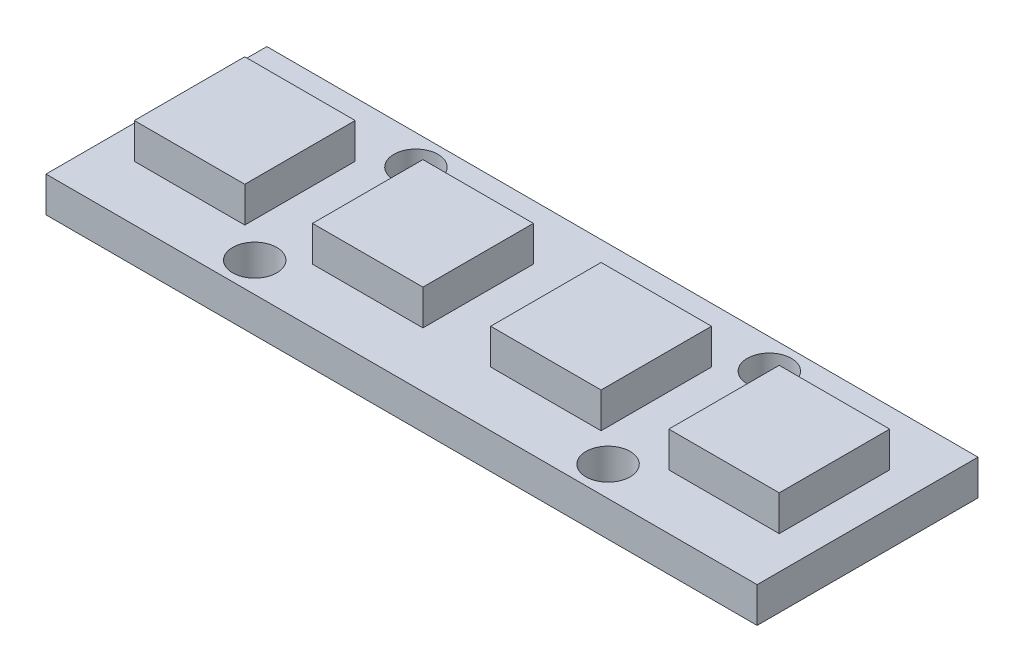
ISO-10303-21;
HEADER;
FILE_DESCRIPTION(('STEP AP214'),'2;1');
FILE_NAME('part.step','',(''),(''),'','','');
FILE_SCHEMA(('AUTOMOTIVE_DESIGN { 1 0 10303 214 1 1 1 1 }'));
ENDSEC;
DATA;
#1=APPLICATION_CONTEXT('core data for automotive mechanical design processes');
#2=APPLICATION_PROTOCOL_DEFINITION('international standard','automotive_design',2000,#1);
#3=PRODUCT_CONTEXT('',#1,'mechanical');
#4=PRODUCT('Part','Part','',(#3));
#5=PRODUCT_RELATED_PRODUCT_CATEGORY('part','',(#4));
#6=PRODUCT_DEFINITION_FORMATION('','',#4);
#7=PRODUCT_DEFINITION_CONTEXT('part definition',#1,'design');
#8=PRODUCT_DEFINITION('design','',#6,#7);
#9=PRODUCT_DEFINITION_SHAPE('','',#8);
#10=(LENGTH_UNIT() NAMED_UNIT(*) SI_UNIT(.MILLI.,.METRE.));
#11=(NAMED_UNIT(*) PLANE_ANGLE_UNIT() SI_UNIT($,.RADIAN.));
#12=(NAMED_UNIT(*) SI_UNIT($,.STERADIAN.) SOLID_ANGLE_UNIT());
#13=UNCERTAINTY_MEASURE_WITH_UNIT(LENGTH_MEASURE(1.E-05),#10,'distance_accuracy_value','');
#14=(GEOMETRIC_REPRESENTATION_CONTEXT(3) GLOBAL_UNCERTAINTY_ASSIGNED_CONTEXT((#13)) GLOBAL_UNIT_ASSIGNED_CONTEXT((#10,
#11,#12)) REPRESENTATION_CONTEXT('',''));
#15=CARTESIAN_POINT('',(0.,0.,0.));
#16=DIRECTION('',(0.,0.,1.));
#17=DIRECTION('',(1.,0.,0.));
#18=AXIS2_PLACEMENT_3D('',#15,#16,#17);
#19=CARTESIAN_POINT('',(0.,1.6,0.));
#20=DIRECTION('',(0.,1.,0.));
#21=DIRECTION('',(0.,0.,1.));
#22=AXIS2_PLACEMENT_3D('',#19,#20,#21);
#23=PLANE('',#22);
#24=CARTESIAN_POINT('',(8.,1.6,3.65));
#25=DIRECTION('',(0.,1.,0.));
#26=DIRECTION('',(0.,0.,-1.));
#27=AXIS2_PLACEMENT_3D('',#24,#25,#26);
#28=CIRCLE('',#27,1.);
#29=CARTESIAN_POINT('',(8.,1.6,2.65));
#30=VERTEX_POINT('',#29);
#31=EDGE_CURVE('E293',#30,#30,#28,.T.);
#32=ORIENTED_EDGE('',*,*,#31,.F.);
#33=EDGE_LOOP('',(#32));
#34=FACE_BOUND('',#33,.T.);
#35=CARTESIAN_POINT('',(-8.,1.6,-3.65));
#36=DIRECTION('',(0.,1.,0.));
#37=DIRECTION('',(0.,0.,1.));
#38=AXIS2_PLACEMENT_3D('',#35,#36,#37);
#39=CIRCLE('',#38,1.);
#40=CARTESIAN_POINT('',(-8.,1.6,-2.65));
#41=VERTEX_POINT('',#40);
#42=EDGE_CURVE('E305',#41,#41,#39,.T.);
#43=ORIENTED_EDGE('',*,*,#42,.F.);
#44=EDGE_LOOP('',(#43));
#45=FACE_BOUND('',#44,.T.);
#46=DIRECTION('',(0.,0.,-1.));
#47=VECTOR('',#46,1.);
#48=CARTESIAN_POINT('',(16.1,1.6,-5.));
#49=LINE('',#48,#47);
#50=CARTESIAN_POINT('',(16.1,1.6,5.));
#51=VERTEX_POINT('',#50);
#52=CARTESIAN_POINT('',(16.1,1.6,-5.));
#53=VERTEX_POINT('',#52);
#54=EDGE_CURVE('E311',#51,#53,#49,.T.);
#55=ORIENTED_EDGE('',*,*,#54,.T.);
#56=DIRECTION('',(-1.,0.,0.));
#57=VECTOR('',#56,1.);
#58=CARTESIAN_POINT('',(-16.1,1.6,-5.));
#59=LINE('',#58,#57);
#60=CARTESIAN_POINT('',(-16.1,1.6,-5.));
#61=VERTEX_POINT('',#60);
#62=EDGE_CURVE('E314',#53,#61,#59,.T.);
#63=ORIENTED_EDGE('',*,*,#62,.T.);
#64=DIRECTION('',(0.,0.,1.));
#65=VECTOR('',#64,1.);
#66=CARTESIAN_POINT('',(-16.1,1.6,-5.));
#67=LINE('',#66,#65);
#68=CARTESIAN_POINT('',(-16.1,1.6,5.));
#69=VERTEX_POINT('',#68);
#70=EDGE_CURVE('E317',#61,#69,#67,.T.);
#71=ORIENTED_EDGE('',*,*,#70,.T.);
#72=DIRECTION('',(1.,0.,0.));
#73=VECTOR('',#72,1.);
#74=CARTESIAN_POINT('',(-16.1,1.6,5.));
#75=LINE('',#74,#73);
#76=EDGE_CURVE('E319',#69,#51,#75,.T.);
#77=ORIENTED_EDGE('',*,*,#76,.T.);
#78=EDGE_LOOP('',(#55,#63,#71,#77));
#79=FACE_BOUND('',#78,.T.);
#80=CARTESIAN_POINT('',(8.,1.6,-3.65));
#81=DIRECTION('',(0.,1.,0.));
#82=DIRECTION('',(0.,0.,1.));
#83=AXIS2_PLACEMENT_3D('',#80,#81,#82);
#84=CIRCLE('',#83,1.);
#85=CARTESIAN_POINT('',(8.,1.6,-2.65));
#86=VERTEX_POINT('',#85);
#87=EDGE_CURVE('E299',#86,#86,#84,.T.);
#88=ORIENTED_EDGE('',*,*,#87,.F.);
#89=EDGE_LOOP('',(#88));
#90=FACE_BOUND('',#89,.T.);
#91=CARTESIAN_POINT('',(-8.,1.6,3.65));
#92=DIRECTION('',(0.,1.,0.));
#93=DIRECTION('',(0.,0.,-1.));
#94=AXIS2_PLACEMENT_3D('',#91,#92,#93);
#95=CIRCLE('',#94,1.);
#96=CARTESIAN_POINT('',(-8.,1.6,2.65));
#97=VERTEX_POINT('',#96);
#98=EDGE_CURVE('E287',#97,#97,#95,.T.);
#99=ORIENTED_EDGE('',*,*,#98,.F.);
#100=EDGE_LOOP('',(#99));
#101=FACE_BOUND('',#100,.T.);
#102=DIRECTION('',(-1.,0.,0.));
#103=VECTOR('',#102,1.);
#104=CARTESIAN_POINT('',(-14.6,1.6,-2.5));
#105=LINE('',#104,#103);
#106=CARTESIAN_POINT('',(-9.6,1.6,-2.5));
#107=VERTEX_POINT('',#106);
#108=CARTESIAN_POINT('',(-14.6,1.6,-2.5));
#109=VERTEX_POINT('',#108);
#110=EDGE_CURVE('E271',#107,#109,#105,.T.);
#111=ORIENTED_EDGE('',*,*,#110,.F.);
#112=DIRECTION('',(0.,0.,-1.));
#113=VECTOR('',#112,1.);
#114=CARTESIAN_POINT('',(-9.6,1.6,-2.5));
#115=LINE('',#114,#113);
#116=CARTESIAN_POINT('',(-9.6,1.6,2.5));
#117=VERTEX_POINT('',#116);
#118=EDGE_CURVE('E257',#117,#107,#115,.T.);
#119=ORIENTED_EDGE('',*,*,#118,.F.);
#120=DIRECTION('',(1.,0.,0.));
#121=VECTOR('',#120,1.);
#122=CARTESIAN_POINT('',(-14.6,1.6,2.5));
#123=LINE('',#122,#121);
#124=CARTESIAN_POINT('',(-14.6,1.6,2.5));
#125=VERTEX_POINT('',#124);
#126=EDGE_CURVE('E262',#125,#117,#123,.T.);
#127=ORIENTED_EDGE('',*,*,#126,.F.);
#128=DIRECTION('',(0.,0.,1.));
#129=VECTOR('',#128,1.);
#130=CARTESIAN_POINT('',(-14.6,1.6,-2.5));
#131=LINE('',#130,#129);
#132=EDGE_CURVE('E273',#109,#125,#131,.T.);
#133=ORIENTED_EDGE('',*,*,#132,.F.);
#134=EDGE_LOOP('',(#111,#119,#127,#133));
#135=FACE_BOUND('',#134,.T.);
#136=DIRECTION('',(-1.,0.,0.));
#137=VECTOR('',#136,1.);
#138=CARTESIAN_POINT('',(-6.53333333333334,1.6,-2.5));
#139=LINE('',#138,#137);
#140=CARTESIAN_POINT('',(-1.53333333333334,1.6,-2.5));
#141=VERTEX_POINT('',#140);
#142=CARTESIAN_POINT('',(-6.53333333333334,1.6,-2.5));
#143=VERTEX_POINT('',#142);
#144=EDGE_CURVE('E242',#141,#143,#139,.T.);
#145=ORIENTED_EDGE('',*,*,#144,.F.);
#146=DIRECTION('',(0.,0.,-1.));
#147=VECTOR('',#146,1.);
#148=CARTESIAN_POINT('',(-1.53333333333334,1.6,-2.5));
#149=LINE('',#148,#147);
#150=CARTESIAN_POINT('',(-1.53333333333334,1.6,2.5));
#151=VERTEX_POINT('',#150);
#152=EDGE_CURVE('E228',#151,#141,#149,.T.);
#153=ORIENTED_EDGE('',*,*,#152,.F.);
#154=DIRECTION('',(1.,0.,0.));
#155=VECTOR('',#154,1.);
#156=CARTESIAN_POINT('',(-6.53333333333334,1.6,2.5));
#157=LINE('',#156,#155);
#158=CARTESIAN_POINT('',(-6.53333333333334,1.6,2.5));
#159=VERTEX_POINT('',#158);
#160=EDGE_CURVE('E233',#159,#151,#157,.T.);
#161=ORIENTED_EDGE('',*,*,#160,.F.);
#162=DIRECTION('',(0.,0.,1.));
#163=VECTOR('',#162,1.);
#164=CARTESIAN_POINT('',(-6.53333333333334,1.6,-2.5));
#165=LINE('',#164,#163);
#166=EDGE_CURVE('E244',#143,#159,#165,.T.);
#167=ORIENTED_EDGE('',*,*,#166,.F.);
#168=EDGE_LOOP('',(#145,#153,#161,#167));
#169=FACE_BOUND('',#168,.T.);
#170=DIRECTION('',(-1.,0.,0.));
#171=VECTOR('',#170,1.);
#172=CARTESIAN_POINT('',(1.53333333333333,1.6,-2.5));
#173=LINE('',#172,#171);
#174=CARTESIAN_POINT('',(6.53333333333333,1.6,-2.5));
#175=VERTEX_POINT('',#174);
#176=CARTESIAN_POINT('',(1.53333333333333,1.6,-2.5));
#177=VERTEX_POINT('',#176);
#178=EDGE_CURVE('E200',#175,#177,#173,.T.);
#179=ORIENTED_EDGE('',*,*,#178,.F.);
#180=DIRECTION('',(0.,0.,-1.));
#181=VECTOR('',#180,1.);
#182=CARTESIAN_POINT('',(6.53333333333333,1.6,-2.5));
#183=LINE('',#182,#181);
#184=CARTESIAN_POINT('',(6.53333333333333,1.6,2.5));
#185=VERTEX_POINT('',#184);
#186=EDGE_CURVE('E197',#185,#175,#183,.T.);
#187=ORIENTED_EDGE('',*,*,#186,.F.);
#188=DIRECTION('',(1.,0.,0.));
#189=VECTOR('',#188,1.);
#190=CARTESIAN_POINT('',(1.53333333333333,1.6,2.5));
#191=LINE('',#190,#189);
#192=CARTESIAN_POINT('',(1.53333333333333,1.6,2.5));
#193=VERTEX_POINT('',#192);
#194=EDGE_CURVE('E209',#193,#185,#191,.T.);
#195=ORIENTED_EDGE('',*,*,#194,.F.);
#196=DIRECTION('',(0.,0.,1.));
#197=VECTOR('',#196,1.);
#198=CARTESIAN_POINT('',(1.53333333333333,1.6,-2.5));
#199=LINE('',#198,#197);
#200=EDGE_CURVE('E217',#177,#193,#199,.T.);
#201=ORIENTED_EDGE('',*,*,#200,.F.);
#202=EDGE_LOOP('',(#179,#187,#195,#201));
#203=FACE_BOUND('',#202,.T.);
#204=DIRECTION('',(-1.,0.,0.));
#205=VECTOR('',#204,1.);
#206=CARTESIAN_POINT('',(9.59999999999999,1.6,-2.5));
#207=LINE('',#206,#205);
#208=CARTESIAN_POINT('',(14.6,1.6,-2.5));
#209=VERTEX_POINT('',#208);
#210=CARTESIAN_POINT('',(9.59999999999999,1.6,-2.5));
#211=VERTEX_POINT('',#210);
#212=EDGE_CURVE('E658',#209,#211,#207,.T.);
#213=ORIENTED_EDGE('',*,*,#212,.F.);
#214=DIRECTION('',(0.,0.,-1.));
#215=VECTOR('',#214,1.);
#216=CARTESIAN_POINT('',(14.6,1.6,-2.5));
#217=LINE('',#216,#215);
#218=CARTESIAN_POINT('',(14.6,1.6,2.5));
#219=VERTEX_POINT('',#218);
#220=EDGE_CURVE('E195',#219,#209,#217,.T.);
#221=ORIENTED_EDGE('',*,*,#220,.F.);
#222=DIRECTION('',(1.,0.,0.));
#223=VECTOR('',#222,1.);
#224=CARTESIAN_POINT('',(9.59999999999999,1.6,2.5));
#225=LINE('',#224,#223);
#226=CARTESIAN_POINT('',(9.59999999999999,1.6,2.5));
#227=VERTEX_POINT('',#226);
#228=EDGE_CURVE('E191',#227,#219,#225,.T.);
#229=ORIENTED_EDGE('',*,*,#228,.F.);
#230=DIRECTION('',(0.,0.,1.));
#231=VECTOR('',#230,1.);
#232=CARTESIAN_POINT('',(9.59999999999999,1.6,-2.5));
#233=LINE('',#232,#231);
#234=EDGE_CURVE('E655',#211,#227,#233,.T.);
#235=ORIENTED_EDGE('',*,*,#234,.F.);
#236=EDGE_LOOP('',(#213,#221,#229,#235));
#237=FACE_BOUND('',#236,.T.);
#238=ADVANCED_FACE('F34',(#34,#45,#79,#90,#101,#135,#169,#203,#237),#23,.T.);
#239=CARTESIAN_POINT('',(0.,0.,0.));
#240=DIRECTION('',(0.,1.,0.));
#241=DIRECTION('',(0.,0.,1.));
#242=AXIS2_PLACEMENT_3D('',#239,#240,#241);
#243=PLANE('',#242);
#244=DIRECTION('',(0.,0.,-1.));
#245=VECTOR('',#244,1.);
#246=CARTESIAN_POINT('',(16.1,0.,-5.));
#247=LINE('',#246,#245);
#248=CARTESIAN_POINT('',(16.1,0.,5.));
#249=VERTEX_POINT('',#248);
#250=CARTESIAN_POINT('',(16.1,0.,-5.));
#251=VERTEX_POINT('',#250);
#252=EDGE_CURVE('E308',#249,#251,#247,.T.);
#253=ORIENTED_EDGE('',*,*,#252,.F.);
#254=DIRECTION('',(1.,0.,0.));
#255=VECTOR('',#254,1.);
#256=CARTESIAN_POINT('',(-16.1,0.,5.));
#257=LINE('',#256,#255);
#258=CARTESIAN_POINT('',(-16.1,0.,5.));
#259=VERTEX_POINT('',#258);
#260=EDGE_CURVE('E315',#259,#249,#257,.T.);
#261=ORIENTED_EDGE('',*,*,#260,.F.);
#262=DIRECTION('',(0.,0.,1.));
#263=VECTOR('',#262,1.);
#264=CARTESIAN_POINT('',(-16.1,0.,-5.));
#265=LINE('',#264,#263);
#266=CARTESIAN_POINT('',(-16.1,0.,-5.));
#267=VERTEX_POINT('',#266);
#268=EDGE_CURVE('E326',#267,#259,#265,.T.);
#269=ORIENTED_EDGE('',*,*,#268,.F.);
#270=DIRECTION('',(-1.,0.,0.));
#271=VECTOR('',#270,1.);
#272=CARTESIAN_POINT('',(-16.1,0.,-5.));
#273=LINE('',#272,#271);
#274=EDGE_CURVE('E324',#251,#267,#273,.T.);
#275=ORIENTED_EDGE('',*,*,#274,.F.);
#276=EDGE_LOOP('',(#253,#261,#269,#275));
#277=FACE_BOUND('',#276,.T.);
#278=CARTESIAN_POINT('',(-8.,0.,-3.65));
#279=DIRECTION('',(0.,1.,0.));
#280=DIRECTION('',(0.,0.,1.));
#281=AXIS2_PLACEMENT_3D('',#278,#279,#280);
#282=CIRCLE('',#281,1.);
#283=CARTESIAN_POINT('',(-8.,0.,-2.65));
#284=VERTEX_POINT('',#283);
#285=EDGE_CURVE('E302',#284,#284,#282,.T.);
#286=ORIENTED_EDGE('',*,*,#285,.T.);
#287=EDGE_LOOP('',(#286));
#288=FACE_BOUND('',#287,.T.);
#289=CARTESIAN_POINT('',(8.,0.,-3.65));
#290=DIRECTION('',(0.,1.,0.));
#291=DIRECTION('',(0.,0.,1.));
#292=AXIS2_PLACEMENT_3D('',#289,#290,#291);
#293=CIRCLE('',#292,1.);
#294=CARTESIAN_POINT('',(8.,0.,-2.65));
#295=VERTEX_POINT('',#294);
#296=EDGE_CURVE('E296',#295,#295,#293,.T.);
#297=ORIENTED_EDGE('',*,*,#296,.T.);
#298=EDGE_LOOP('',(#297));
#299=FACE_BOUND('',#298,.T.);
#300=CARTESIAN_POINT('',(8.,0.,3.65));
#301=DIRECTION('',(0.,1.,0.));
#302=DIRECTION('',(0.,0.,-1.));
#303=AXIS2_PLACEMENT_3D('',#300,#301,#302);
#304=CIRCLE('',#303,1.);
#305=CARTESIAN_POINT('',(8.,0.,2.65));
#306=VERTEX_POINT('',#305);
#307=EDGE_CURVE('E290',#306,#306,#304,.T.);
#308=ORIENTED_EDGE('',*,*,#307,.T.);
#309=EDGE_LOOP('',(#308));
#310=FACE_BOUND('',#309,.T.);
#311=CARTESIAN_POINT('',(-8.,0.,3.65));
#312=DIRECTION('',(0.,1.,0.));
#313=DIRECTION('',(0.,0.,-1.));
#314=AXIS2_PLACEMENT_3D('',#311,#312,#313);
#315=CIRCLE('',#314,1.);
#316=CARTESIAN_POINT('',(-8.,0.,2.65));
#317=VERTEX_POINT('',#316);
#318=EDGE_CURVE('E286',#317,#317,#315,.T.);
#319=ORIENTED_EDGE('',*,*,#318,.T.);
#320=EDGE_LOOP('',(#319));
#321=FACE_BOUND('',#320,.T.);
#322=ADVANCED_FACE('F344',(#277,#288,#299,#310,#321),#243,.F.);
#323=CARTESIAN_POINT('',(16.1,1.6,-5.));
#324=DIRECTION('',(-1.,0.,0.));
#325=DIRECTION('',(0.,0.,1.));
#326=AXIS2_PLACEMENT_3D('',#323,#324,#325);
#327=PLANE('',#326);
#328=ORIENTED_EDGE('',*,*,#252,.T.);
#329=DIRECTION('',(0.,-1.,0.));
#330=VECTOR('',#329,1.);
#331=CARTESIAN_POINT('',(16.1,1.6,-5.));
#332=LINE('',#331,#330);
#333=EDGE_CURVE('E11',#53,#251,#332,.T.);
#334=ORIENTED_EDGE('',*,*,#333,.F.);
#335=ORIENTED_EDGE('',*,*,#54,.F.);
#336=DIRECTION('',(0.,-1.,0.));
#337=VECTOR('',#336,1.);
#338=CARTESIAN_POINT('',(16.1,1.6,5.));
#339=LINE('',#338,#337);
#340=EDGE_CURVE('E321',#51,#249,#339,.T.);
#341=ORIENTED_EDGE('',*,*,#340,.T.);
#342=EDGE_LOOP('',(#328,#334,#335,#341));
#343=FACE_BOUND('',#342,.T.);
#344=ADVANCED_FACE('F36',(#343),#327,.F.);
#345=CARTESIAN_POINT('',(-16.1,1.6,-5.));
#346=DIRECTION('',(0.,0.,1.));
#347=DIRECTION('',(1.,0.,0.));
#348=AXIS2_PLACEMENT_3D('',#345,#346,#347);
#349=PLANE('',#348);
#350=ORIENTED_EDGE('',*,*,#274,.T.);
#351=DIRECTION('',(0.,-1.,0.));
#352=VECTOR('',#351,1.);
#353=CARTESIAN_POINT('',(-16.1,1.6,-5.));
#354=LINE('',#353,#352);
#355=EDGE_CURVE('E42',#61,#267,#354,.T.);
#356=ORIENTED_EDGE('',*,*,#355,.F.);
#357=ORIENTED_EDGE('',*,*,#62,.F.);
#358=ORIENTED_EDGE('',*,*,#333,.T.);
#359=EDGE_LOOP('',(#350,#356,#357,#358));
#360=FACE_BOUND('',#359,.T.);
#361=ADVANCED_FACE('F355',(#360),#349,.F.);
#362=CARTESIAN_POINT('',(-16.1,1.6,-5.));
#363=DIRECTION('',(1.,0.,0.));
#364=DIRECTION('',(0.,0.,-1.));
#365=AXIS2_PLACEMENT_3D('',#362,#363,#364);
#366=PLANE('',#365);
#367=ORIENTED_EDGE('',*,*,#268,.T.);
#368=DIRECTION('',(0.,-1.,0.));
#369=VECTOR('',#368,1.);
#370=CARTESIAN_POINT('',(-16.1,1.6,5.));
#371=LINE('',#370,#369);
#372=EDGE_CURVE('E331',#69,#259,#371,.T.);
#373=ORIENTED_EDGE('',*,*,#372,.F.);
#374=ORIENTED_EDGE('',*,*,#70,.F.);
#375=ORIENTED_EDGE('',*,*,#355,.T.);
#376=EDGE_LOOP('',(#367,#373,#374,#375));
#377=FACE_BOUND('',#376,.T.);
#378=ADVANCED_FACE('F338',(#377),#366,.F.);
#379=CARTESIAN_POINT('',(-16.1,1.6,5.));
#380=DIRECTION('',(0.,0.,-1.));
#381=DIRECTION('',(-1.,0.,0.));
#382=AXIS2_PLACEMENT_3D('',#379,#380,#381);
#383=PLANE('',#382);
#384=ORIENTED_EDGE('',*,*,#260,.T.);
#385=ORIENTED_EDGE('',*,*,#340,.F.);
#386=ORIENTED_EDGE('',*,*,#76,.F.);
#387=ORIENTED_EDGE('',*,*,#372,.T.);
#388=EDGE_LOOP('',(#384,#385,#386,#387));
#389=FACE_BOUND('',#388,.T.);
#390=ADVANCED_FACE('F348',(#389),#383,.F.);
#391=CARTESIAN_POINT('',(-8.,1.6,-3.65));
#392=DIRECTION('',(0.,-1.,0.));
#393=DIRECTION('',(0.,0.,-1.));
#394=AXIS2_PLACEMENT_3D('',#391,#392,#393);
#395=CYLINDRICAL_SURFACE('',#394,1.);
#396=ORIENTED_EDGE('',*,*,#42,.T.);
#397=EDGE_LOOP('',(#396));
#398=FACE_BOUND('',#397,.T.);
#399=ORIENTED_EDGE('',*,*,#285,.F.);
#400=EDGE_LOOP('',(#399));
#401=FACE_BOUND('',#400,.T.);
#402=ADVANCED_FACE('F372',(#398,#401),#395,.F.);
#403=CARTESIAN_POINT('',(8.,1.6,-3.65));
#404=DIRECTION('',(0.,-1.,0.));
#405=DIRECTION('',(0.,0.,-1.));
#406=AXIS2_PLACEMENT_3D('',#403,#404,#405);
#407=CYLINDRICAL_SURFACE('',#406,1.);
#408=ORIENTED_EDGE('',*,*,#87,.T.);
#409=EDGE_LOOP('',(#408));
#410=FACE_BOUND('',#409,.T.);
#411=ORIENTED_EDGE('',*,*,#296,.F.);
#412=EDGE_LOOP('',(#411));
#413=FACE_BOUND('',#412,.T.);
#414=ADVANCED_FACE('F379',(#410,#413),#407,.F.);
#415=CARTESIAN_POINT('',(8.,1.6,3.65));
#416=DIRECTION('',(0.,-1.,0.));
#417=DIRECTION('',(0.,0.,-1.));
#418=AXIS2_PLACEMENT_3D('',#415,#416,#417);
#419=CYLINDRICAL_SURFACE('',#418,1.);
#420=ORIENTED_EDGE('',*,*,#31,.T.);
#421=EDGE_LOOP('',(#420));
#422=FACE_BOUND('',#421,.T.);
#423=ORIENTED_EDGE('',*,*,#307,.F.);
#424=EDGE_LOOP('',(#423));
#425=FACE_BOUND('',#424,.T.);
#426=ADVANCED_FACE('F384',(#422,#425),#419,.F.);
#427=CARTESIAN_POINT('',(-8.,1.6,3.65));
#428=DIRECTION('',(0.,-1.,0.));
#429=DIRECTION('',(0.,0.,-1.));
#430=AXIS2_PLACEMENT_3D('',#427,#428,#429);
#431=CYLINDRICAL_SURFACE('',#430,1.);
#432=ORIENTED_EDGE('',*,*,#98,.T.);
#433=EDGE_LOOP('',(#432));
#434=FACE_BOUND('',#433,.T.);
#435=ORIENTED_EDGE('',*,*,#318,.F.);
#436=EDGE_LOOP('',(#435));
#437=FACE_BOUND('',#436,.T.);
#438=ADVANCED_FACE('F396',(#434,#437),#431,.F.);
#439=CARTESIAN_POINT('',(-9.6,3.2,-2.5));
#440=DIRECTION('',(-1.,0.,0.));
#441=DIRECTION('',(0.,0.,1.));
#442=AXIS2_PLACEMENT_3D('',#439,#440,#441);
#443=PLANE('',#442);
#444=ORIENTED_EDGE('',*,*,#118,.T.);
#445=DIRECTION('',(0.,-1.,0.));
#446=VECTOR('',#445,1.);
#447=CARTESIAN_POINT('',(-9.6,3.2,-2.5));
#448=LINE('',#447,#446);
#449=CARTESIAN_POINT('',(-9.6,3.2,-2.5));
#450=VERTEX_POINT('',#449);
#451=EDGE_CURVE('E284',#450,#107,#448,.T.);
#452=ORIENTED_EDGE('',*,*,#451,.F.);
#453=DIRECTION('',(0.,0.,-1.));
#454=VECTOR('',#453,1.);
#455=CARTESIAN_POINT('',(-9.6,3.2,-2.5));
#456=LINE('',#455,#454);
#457=CARTESIAN_POINT('',(-9.6,3.2,2.5));
#458=VERTEX_POINT('',#457);
#459=EDGE_CURVE('E258',#458,#450,#456,.T.);
#460=ORIENTED_EDGE('',*,*,#459,.F.);
#461=DIRECTION('',(0.,-1.,0.));
#462=VECTOR('',#461,1.);
#463=CARTESIAN_POINT('',(-9.6,3.2,2.5));
#464=LINE('',#463,#462);
#465=EDGE_CURVE('E268',#458,#117,#464,.T.);
#466=ORIENTED_EDGE('',*,*,#465,.T.);
#467=EDGE_LOOP('',(#444,#452,#460,#466));
#468=FACE_BOUND('',#467,.T.);
#469=ADVANCED_FACE('F398',(#468),#443,.F.);
#470=CARTESIAN_POINT('',(-14.6,3.2,-2.5));
#471=DIRECTION('',(0.,0.,1.));
#472=DIRECTION('',(1.,0.,0.));
#473=AXIS2_PLACEMENT_3D('',#470,#471,#472);
#474=PLANE('',#473);
#475=ORIENTED_EDGE('',*,*,#110,.T.);
#476=DIRECTION('',(0.,-1.,0.));
#477=VECTOR('',#476,1.);
#478=CARTESIAN_POINT('',(-14.6,3.2,-2.5));
#479=LINE('',#478,#477);
#480=CARTESIAN_POINT('',(-14.6,3.2,-2.5));
#481=VERTEX_POINT('',#480);
#482=EDGE_CURVE('E281',#481,#109,#479,.T.);
#483=ORIENTED_EDGE('',*,*,#482,.F.);
#484=DIRECTION('',(-1.,0.,0.));
#485=VECTOR('',#484,1.);
#486=CARTESIAN_POINT('',(-14.6,3.2,-2.5));
#487=LINE('',#486,#485);
#488=EDGE_CURVE('E261',#450,#481,#487,.T.);
#489=ORIENTED_EDGE('',*,*,#488,.F.);
#490=ORIENTED_EDGE('',*,*,#451,.T.);
#491=EDGE_LOOP('',(#475,#483,#489,#490));
#492=FACE_BOUND('',#491,.T.);
#493=ADVANCED_FACE('F405',(#492),#474,.F.);
#494=CARTESIAN_POINT('',(-14.6,3.2,-2.5));
#495=DIRECTION('',(1.,0.,0.));
#496=DIRECTION('',(0.,0.,-1.));
#497=AXIS2_PLACEMENT_3D('',#494,#495,#496);
#498=PLANE('',#497);
#499=ORIENTED_EDGE('',*,*,#132,.T.);
#500=DIRECTION('',(0.,-1.,0.));
#501=VECTOR('',#500,1.);
#502=CARTESIAN_POINT('',(-14.6,3.2,2.5));
#503=LINE('',#502,#501);
#504=CARTESIAN_POINT('',(-14.6,3.2,2.5));
#505=VERTEX_POINT('',#504);
#506=EDGE_CURVE('E279',#505,#125,#503,.T.);
#507=ORIENTED_EDGE('',*,*,#506,.F.);
#508=DIRECTION('',(0.,0.,1.));
#509=VECTOR('',#508,1.);
#510=CARTESIAN_POINT('',(-14.6,3.2,-2.5));
#511=LINE('',#510,#509);
#512=EDGE_CURVE('E264',#481,#505,#511,.T.);
#513=ORIENTED_EDGE('',*,*,#512,.F.);
#514=ORIENTED_EDGE('',*,*,#482,.T.);
#515=EDGE_LOOP('',(#499,#507,#513,#514));
#516=FACE_BOUND('',#515,.T.);
#517=ADVANCED_FACE('F413',(#516),#498,.F.);
#518=CARTESIAN_POINT('',(-14.6,3.2,2.5));
#519=DIRECTION('',(0.,0.,-1.));
#520=DIRECTION('',(-1.,0.,0.));
#521=AXIS2_PLACEMENT_3D('',#518,#519,#520);
#522=PLANE('',#521);
#523=ORIENTED_EDGE('',*,*,#126,.T.);
#524=ORIENTED_EDGE('',*,*,#465,.F.);
#525=DIRECTION('',(1.,0.,0.));
#526=VECTOR('',#525,1.);
#527=CARTESIAN_POINT('',(-14.6,3.2,2.5));
#528=LINE('',#527,#526);
#529=EDGE_CURVE('E266',#505,#458,#528,.T.);
#530=ORIENTED_EDGE('',*,*,#529,.F.);
#531=ORIENTED_EDGE('',*,*,#506,.T.);
#532=EDGE_LOOP('',(#523,#524,#530,#531));
#533=FACE_BOUND('',#532,.T.);
#534=ADVANCED_FACE('F417',(#533),#522,.F.);
#535=CARTESIAN_POINT('',(0.,3.2,0.));
#536=DIRECTION('',(0.,1.,0.));
#537=DIRECTION('',(0.,0.,1.));
#538=AXIS2_PLACEMENT_3D('',#535,#536,#537);
#539=PLANE('',#538);
#540=ORIENTED_EDGE('',*,*,#459,.T.);
#541=ORIENTED_EDGE('',*,*,#488,.T.);
#542=ORIENTED_EDGE('',*,*,#512,.T.);
#543=ORIENTED_EDGE('',*,*,#529,.T.);
#544=EDGE_LOOP('',(#540,#541,#542,#543));
#545=FACE_BOUND('',#544,.T.);
#546=ADVANCED_FACE('F421',(#545),#539,.T.);
#547=CARTESIAN_POINT('',(-1.53333333333334,3.2,-2.5));
#548=DIRECTION('',(-1.,0.,0.));
#549=DIRECTION('',(0.,0.,1.));
#550=AXIS2_PLACEMENT_3D('',#547,#548,#549);
#551=PLANE('',#550);
#552=ORIENTED_EDGE('',*,*,#152,.T.);
#553=DIRECTION('',(0.,-1.,0.));
#554=VECTOR('',#553,1.);
#555=CARTESIAN_POINT('',(-1.53333333333334,3.2,-2.5));
#556=LINE('',#555,#554);
#557=CARTESIAN_POINT('',(-1.53333333333334,3.2,-2.5));
#558=VERTEX_POINT('',#557);
#559=EDGE_CURVE('E255',#558,#141,#556,.T.);
#560=ORIENTED_EDGE('',*,*,#559,.F.);
#561=DIRECTION('',(0.,0.,-1.));
#562=VECTOR('',#561,1.);
#563=CARTESIAN_POINT('',(-1.53333333333334,3.2,-2.5));
#564=LINE('',#563,#562);
#565=CARTESIAN_POINT('',(-1.53333333333334,3.2,2.5));
#566=VERTEX_POINT('',#565);
#567=EDGE_CURVE('E229',#566,#558,#564,.T.);
#568=ORIENTED_EDGE('',*,*,#567,.F.);
#569=DIRECTION('',(0.,-1.,0.));
#570=VECTOR('',#569,1.);
#571=CARTESIAN_POINT('',(-1.53333333333334,3.2,2.5));
#572=LINE('',#571,#570);
#573=EDGE_CURVE('E239',#566,#151,#572,.T.);
#574=ORIENTED_EDGE('',*,*,#573,.T.);
#575=EDGE_LOOP('',(#552,#560,#568,#574));
#576=FACE_BOUND('',#575,.T.);
#577=ADVANCED_FACE('F425',(#576),#551,.F.);
#578=CARTESIAN_POINT('',(-6.53333333333334,3.2,-2.5));
#579=DIRECTION('',(0.,0.,1.));
#580=DIRECTION('',(1.,0.,0.));
#581=AXIS2_PLACEMENT_3D('',#578,#579,#580);
#582=PLANE('',#581);
#583=ORIENTED_EDGE('',*,*,#144,.T.);
#584=DIRECTION('',(0.,-1.,0.));
#585=VECTOR('',#584,1.);
#586=CARTESIAN_POINT('',(-6.53333333333334,3.2,-2.5));
#587=LINE('',#586,#585);
#588=CARTESIAN_POINT('',(-6.53333333333334,3.2,-2.5));
#589=VERTEX_POINT('',#588);
#590=EDGE_CURVE('E252',#589,#143,#587,.T.);
#591=ORIENTED_EDGE('',*,*,#590,.F.);
#592=DIRECTION('',(-1.,0.,0.));
#593=VECTOR('',#592,1.);
#594=CARTESIAN_POINT('',(-6.53333333333334,3.2,-2.5));
#595=LINE('',#594,#593);
#596=EDGE_CURVE('E232',#558,#589,#595,.T.);
#597=ORIENTED_EDGE('',*,*,#596,.F.);
#598=ORIENTED_EDGE('',*,*,#559,.T.);
#599=EDGE_LOOP('',(#583,#591,#597,#598));
#600=FACE_BOUND('',#599,.T.);
#601=ADVANCED_FACE('F429',(#600),#582,.F.);
#602=CARTESIAN_POINT('',(-6.53333333333334,3.2,-2.5));
#603=DIRECTION('',(1.,0.,0.));
#604=DIRECTION('',(0.,0.,-1.));
#605=AXIS2_PLACEMENT_3D('',#602,#603,#604);
#606=PLANE('',#605);
#607=ORIENTED_EDGE('',*,*,#166,.T.);
#608=DIRECTION('',(0.,-1.,0.));
#609=VECTOR('',#608,1.);
#610=CARTESIAN_POINT('',(-6.53333333333334,3.2,2.5));
#611=LINE('',#610,#609);
#612=CARTESIAN_POINT('',(-6.53333333333334,3.2,2.5));
#613=VERTEX_POINT('',#612);
#614=EDGE_CURVE('E250',#613,#159,#611,.T.);
#615=ORIENTED_EDGE('',*,*,#614,.F.);
#616=DIRECTION('',(0.,0.,1.));
#617=VECTOR('',#616,1.);
#618=CARTESIAN_POINT('',(-6.53333333333334,3.2,-2.5));
#619=LINE('',#618,#617);
#620=EDGE_CURVE('E235',#589,#613,#619,.T.);
#621=ORIENTED_EDGE('',*,*,#620,.F.);
#622=ORIENTED_EDGE('',*,*,#590,.T.);
#623=EDGE_LOOP('',(#607,#615,#621,#622));
#624=FACE_BOUND('',#623,.T.);
#625=ADVANCED_FACE('F433',(#624),#606,.F.);
#626=CARTESIAN_POINT('',(-6.53333333333334,3.2,2.5));
#627=DIRECTION('',(0.,0.,-1.));
#628=DIRECTION('',(-1.,0.,0.));
#629=AXIS2_PLACEMENT_3D('',#626,#627,#628);
#630=PLANE('',#629);
#631=ORIENTED_EDGE('',*,*,#160,.T.);
#632=ORIENTED_EDGE('',*,*,#573,.F.);
#633=DIRECTION('',(1.,0.,0.));
#634=VECTOR('',#633,1.);
#635=CARTESIAN_POINT('',(-6.53333333333334,3.2,2.5));
#636=LINE('',#635,#634);
#637=EDGE_CURVE('E237',#613,#566,#636,.T.);
#638=ORIENTED_EDGE('',*,*,#637,.F.);
#639=ORIENTED_EDGE('',*,*,#614,.T.);
#640=EDGE_LOOP('',(#631,#632,#638,#639));
#641=FACE_BOUND('',#640,.T.);
#642=ADVANCED_FACE('F437',(#641),#630,.F.);
#643=CARTESIAN_POINT('',(0.,3.2,0.));
#644=DIRECTION('',(0.,1.,0.));
#645=DIRECTION('',(0.,0.,1.));
#646=AXIS2_PLACEMENT_3D('',#643,#644,#645);
#647=PLANE('',#646);
#648=ORIENTED_EDGE('',*,*,#567,.T.);
#649=ORIENTED_EDGE('',*,*,#596,.T.);
#650=ORIENTED_EDGE('',*,*,#620,.T.);
#651=ORIENTED_EDGE('',*,*,#637,.T.);
#652=EDGE_LOOP('',(#648,#649,#650,#651));
#653=FACE_BOUND('',#652,.T.);
#654=ADVANCED_FACE('F441',(#653),#647,.T.);
#655=CARTESIAN_POINT('',(6.53333333333333,3.2,-2.5));
#656=DIRECTION('',(-1.,0.,0.));
#657=DIRECTION('',(0.,0.,1.));
#658=AXIS2_PLACEMENT_3D('',#655,#656,#657);
#659=PLANE('',#658);
#660=ORIENTED_EDGE('',*,*,#186,.T.);
#661=DIRECTION('',(0.,-1.,0.));
#662=VECTOR('',#661,1.);
#663=CARTESIAN_POINT('',(6.53333333333333,3.2,-2.5));
#664=LINE('',#663,#662);
#665=CARTESIAN_POINT('',(6.53333333333333,3.2,-2.5));
#666=VERTEX_POINT('',#665);
#667=EDGE_CURVE('E226',#666,#175,#664,.T.);
#668=ORIENTED_EDGE('',*,*,#667,.F.);
#669=DIRECTION('',(0.,0.,-1.));
#670=VECTOR('',#669,1.);
#671=CARTESIAN_POINT('',(6.53333333333333,3.2,-2.5));
#672=LINE('',#671,#670);
#673=CARTESIAN_POINT('',(6.53333333333333,3.2,2.5));
#674=VERTEX_POINT('',#673);
#675=EDGE_CURVE('E205',#674,#666,#672,.T.);
#676=ORIENTED_EDGE('',*,*,#675,.F.);
#677=DIRECTION('',(0.,-1.,0.));
#678=VECTOR('',#677,1.);
#679=CARTESIAN_POINT('',(6.53333333333333,3.2,2.5));
#680=LINE('',#679,#678);
#681=EDGE_CURVE('E214',#674,#185,#680,.T.);
#682=ORIENTED_EDGE('',*,*,#681,.T.);
#683=EDGE_LOOP('',(#660,#668,#676,#682));
#684=FACE_BOUND('',#683,.T.);
#685=ADVANCED_FACE('F445',(#684),#659,.F.);
#686=CARTESIAN_POINT('',(1.53333333333333,3.2,-2.5));
#687=DIRECTION('',(0.,0.,1.));
#688=DIRECTION('',(1.,0.,0.));
#689=AXIS2_PLACEMENT_3D('',#686,#687,#688);
#690=PLANE('',#689);
#691=ORIENTED_EDGE('',*,*,#178,.T.);
#692=DIRECTION('',(0.,-1.,0.));
#693=VECTOR('',#692,1.);
#694=CARTESIAN_POINT('',(1.53333333333333,3.2,-2.5));
#695=LINE('',#694,#693);
#696=CARTESIAN_POINT('',(1.53333333333333,3.2,-2.5));
#697=VERTEX_POINT('',#696);
#698=EDGE_CURVE('E223',#697,#177,#695,.T.);
#699=ORIENTED_EDGE('',*,*,#698,.F.);
#700=DIRECTION('',(-1.,0.,0.));
#701=VECTOR('',#700,1.);
#702=CARTESIAN_POINT('',(1.53333333333333,3.2,-2.5));
#703=LINE('',#702,#701);
#704=EDGE_CURVE('E208',#666,#697,#703,.T.);
#705=ORIENTED_EDGE('',*,*,#704,.F.);
#706=ORIENTED_EDGE('',*,*,#667,.T.);
#707=EDGE_LOOP('',(#691,#699,#705,#706));
#708=FACE_BOUND('',#707,.T.);
#709=ADVANCED_FACE('F449',(#708),#690,.F.);
#710=CARTESIAN_POINT('',(1.53333333333333,3.2,-2.5));
#711=DIRECTION('',(1.,0.,0.));
#712=DIRECTION('',(0.,0.,-1.));
#713=AXIS2_PLACEMENT_3D('',#710,#711,#712);
#714=PLANE('',#713);
#715=ORIENTED_EDGE('',*,*,#200,.T.);
#716=DIRECTION('',(0.,-1.,0.));
#717=VECTOR('',#716,1.);
#718=CARTESIAN_POINT('',(1.53333333333333,3.2,2.5));
#719=LINE('',#718,#717);
#720=CARTESIAN_POINT('',(1.53333333333333,3.2,2.5));
#721=VERTEX_POINT('',#720);
#722=EDGE_CURVE('E57',#721,#193,#719,.T.);
#723=ORIENTED_EDGE('',*,*,#722,.F.);
#724=DIRECTION('',(0.,0.,1.));
#725=VECTOR('',#724,1.);
#726=CARTESIAN_POINT('',(1.53333333333333,3.2,-2.5));
#727=LINE('',#726,#725);
#728=EDGE_CURVE('E211',#697,#721,#727,.T.);
#729=ORIENTED_EDGE('',*,*,#728,.F.);
#730=ORIENTED_EDGE('',*,*,#698,.T.);
#731=EDGE_LOOP('',(#715,#723,#729,#730));
#732=FACE_BOUND('',#731,.T.);
#733=ADVANCED_FACE('F453',(#732),#714,.F.);
#734=CARTESIAN_POINT('',(1.53333333333333,3.2,2.5));
#735=DIRECTION('',(0.,0.,-1.));
#736=DIRECTION('',(-1.,0.,0.));
#737=AXIS2_PLACEMENT_3D('',#734,#735,#736);
#738=PLANE('',#737);
#739=ORIENTED_EDGE('',*,*,#194,.T.);
#740=ORIENTED_EDGE('',*,*,#681,.F.);
#741=DIRECTION('',(1.,0.,0.));
#742=VECTOR('',#741,1.);
#743=CARTESIAN_POINT('',(1.53333333333333,3.2,2.5));
#744=LINE('',#743,#742);
#745=EDGE_CURVE('E213',#721,#674,#744,.T.);
#746=ORIENTED_EDGE('',*,*,#745,.F.);
#747=ORIENTED_EDGE('',*,*,#722,.T.);
#748=EDGE_LOOP('',(#739,#740,#746,#747));
#749=FACE_BOUND('',#748,.T.);
#750=ADVANCED_FACE('F457',(#749),#738,.F.);
#751=CARTESIAN_POINT('',(0.,3.2,0.));
#752=DIRECTION('',(0.,1.,0.));
#753=DIRECTION('',(0.,0.,1.));
#754=AXIS2_PLACEMENT_3D('',#751,#752,#753);
#755=PLANE('',#754);
#756=ORIENTED_EDGE('',*,*,#675,.T.);
#757=ORIENTED_EDGE('',*,*,#704,.T.);
#758=ORIENTED_EDGE('',*,*,#728,.T.);
#759=ORIENTED_EDGE('',*,*,#745,.T.);
#760=EDGE_LOOP('',(#756,#757,#758,#759));
#761=FACE_BOUND('',#760,.T.);
#762=ADVANCED_FACE('F461',(#761),#755,.T.);
#763=CARTESIAN_POINT('',(14.6,3.2,-2.5));
#764=DIRECTION('',(-1.,0.,0.));
#765=DIRECTION('',(0.,0.,1.));
#766=AXIS2_PLACEMENT_3D('',#763,#764,#765);
#767=PLANE('',#766);
#768=ORIENTED_EDGE('',*,*,#220,.T.);
#769=DIRECTION('',(0.,-1.,0.));
#770=VECTOR('',#769,1.);
#771=CARTESIAN_POINT('',(14.6,3.2,-2.5));
#772=LINE('',#771,#770);
#773=CARTESIAN_POINT('',(14.6,3.2,-2.5));
#774=VERTEX_POINT('',#773);
#775=EDGE_CURVE('E176',#774,#209,#772,.T.);
#776=ORIENTED_EDGE('',*,*,#775,.F.);
#777=DIRECTION('',(0.,0.,-1.));
#778=VECTOR('',#777,1.);
#779=CARTESIAN_POINT('',(14.6,3.2,-2.5));
#780=LINE('',#779,#778);
#781=CARTESIAN_POINT('',(14.6,3.2,2.5));
#782=VERTEX_POINT('',#781);
#783=EDGE_CURVE('E183',#782,#774,#780,.T.);
#784=ORIENTED_EDGE('',*,*,#783,.F.);
#785=DIRECTION('',(0.,-1.,0.));
#786=VECTOR('',#785,1.);
#787=CARTESIAN_POINT('',(14.6,3.2,2.5));
#788=LINE('',#787,#786);
#789=EDGE_CURVE('E652',#782,#219,#788,.T.);
#790=ORIENTED_EDGE('',*,*,#789,.T.);
#791=EDGE_LOOP('',(#768,#776,#784,#790));
#792=FACE_BOUND('',#791,.T.);
#793=ADVANCED_FACE('F193',(#792),#767,.F.);
#794=CARTESIAN_POINT('',(9.59999999999999,3.2,-2.5));
#795=DIRECTION('',(0.,0.,1.));
#796=DIRECTION('',(1.,0.,0.));
#797=AXIS2_PLACEMENT_3D('',#794,#795,#796);
#798=PLANE('',#797);
#799=ORIENTED_EDGE('',*,*,#212,.T.);
#800=DIRECTION('',(0.,-1.,0.));
#801=VECTOR('',#800,1.);
#802=CARTESIAN_POINT('',(9.59999999999999,3.2,-2.5));
#803=LINE('',#802,#801);
#804=CARTESIAN_POINT('',(9.59999999999999,3.2,-2.5));
#805=VERTEX_POINT('',#804);
#806=EDGE_CURVE('E179',#805,#211,#803,.T.);
#807=ORIENTED_EDGE('',*,*,#806,.F.);
#808=DIRECTION('',(-1.,0.,0.));
#809=VECTOR('',#808,1.);
#810=CARTESIAN_POINT('',(9.59999999999999,3.2,-2.5));
#811=LINE('',#810,#809);
#812=EDGE_CURVE('E172',#774,#805,#811,.T.);
#813=ORIENTED_EDGE('',*,*,#812,.F.);
#814=ORIENTED_EDGE('',*,*,#775,.T.);
#815=EDGE_LOOP('',(#799,#807,#813,#814));
#816=FACE_BOUND('',#815,.T.);
#817=ADVANCED_FACE('F174',(#816),#798,.F.);
#818=CARTESIAN_POINT('',(9.59999999999999,3.2,-2.5));
#819=DIRECTION('',(1.,0.,0.));
#820=DIRECTION('',(0.,0.,-1.));
#821=AXIS2_PLACEMENT_3D('',#818,#819,#820);
#822=PLANE('',#821);
#823=ORIENTED_EDGE('',*,*,#234,.T.);
#824=DIRECTION('',(0.,-1.,0.));
#825=VECTOR('',#824,1.);
#826=CARTESIAN_POINT('',(9.59999999999999,3.2,2.5));
#827=LINE('',#826,#825);
#828=CARTESIAN_POINT('',(9.59999999999999,3.2,2.5));
#829=VERTEX_POINT('',#828);
#830=EDGE_CURVE('E49',#829,#227,#827,.T.);
#831=ORIENTED_EDGE('',*,*,#830,.F.);
#832=DIRECTION('',(0.,0.,1.));
#833=VECTOR('',#832,1.);
#834=CARTESIAN_POINT('',(9.59999999999999,3.2,-2.5));
#835=LINE('',#834,#833);
#836=EDGE_CURVE('E182',#805,#829,#835,.T.);
#837=ORIENTED_EDGE('',*,*,#836,.F.);
#838=ORIENTED_EDGE('',*,*,#806,.T.);
#839=EDGE_LOOP('',(#823,#831,#837,#838));
#840=FACE_BOUND('',#839,.T.);
#841=ADVANCED_FACE('F469',(#840),#822,.F.);
#842=CARTESIAN_POINT('',(9.59999999999999,3.2,2.5));
#843=DIRECTION('',(0.,0.,-1.));
#844=DIRECTION('',(-1.,0.,0.));
#845=AXIS2_PLACEMENT_3D('',#842,#843,#844);
#846=PLANE('',#845);
#847=ORIENTED_EDGE('',*,*,#228,.T.);
#848=ORIENTED_EDGE('',*,*,#789,.F.);
#849=DIRECTION('',(1.,0.,0.));
#850=VECTOR('',#849,1.);
#851=CARTESIAN_POINT('',(9.59999999999999,3.2,2.5));
#852=LINE('',#851,#850);
#853=EDGE_CURVE('E187',#829,#782,#852,.T.);
#854=ORIENTED_EDGE('',*,*,#853,.F.);
#855=ORIENTED_EDGE('',*,*,#830,.T.);
#856=EDGE_LOOP('',(#847,#848,#854,#855));
#857=FACE_BOUND('',#856,.T.);
#858=ADVANCED_FACE('F472',(#857),#846,.F.);
#859=CARTESIAN_POINT('',(0.,3.2,0.));
#860=DIRECTION('',(0.,1.,0.));
#861=DIRECTION('',(0.,0.,1.));
#862=AXIS2_PLACEMENT_3D('',#859,#860,#861);
#863=PLANE('',#862);
#864=ORIENTED_EDGE('',*,*,#783,.T.);
#865=ORIENTED_EDGE('',*,*,#812,.T.);
#866=ORIENTED_EDGE('',*,*,#836,.T.);
#867=ORIENTED_EDGE('',*,*,#853,.T.);
#868=EDGE_LOOP('',(#864,#865,#866,#867));
#869=FACE_BOUND('',#868,.T.);
#870=ADVANCED_FACE('F186',(#869),#863,.T.);
#871=CLOSED_SHELL('',(#238,#322,#344,#361,#378,#390,#402,#414,#426,#438,#469,#493,#517,#534,
#546,#577,#601,#625,#642,#654,#685,#709,#733,#750,#762,#793,#817,#841,#858,#870));
#872=MANIFOLD_SOLID_BREP('B2',#871);
#873=ADVANCED_BREP_SHAPE_REPRESENTATION('',(#18,#872),#14);
#874=SHAPE_DEFINITION_REPRESENTATION(#9,#873);
ENDSEC;
END-ISO-10303-21;
